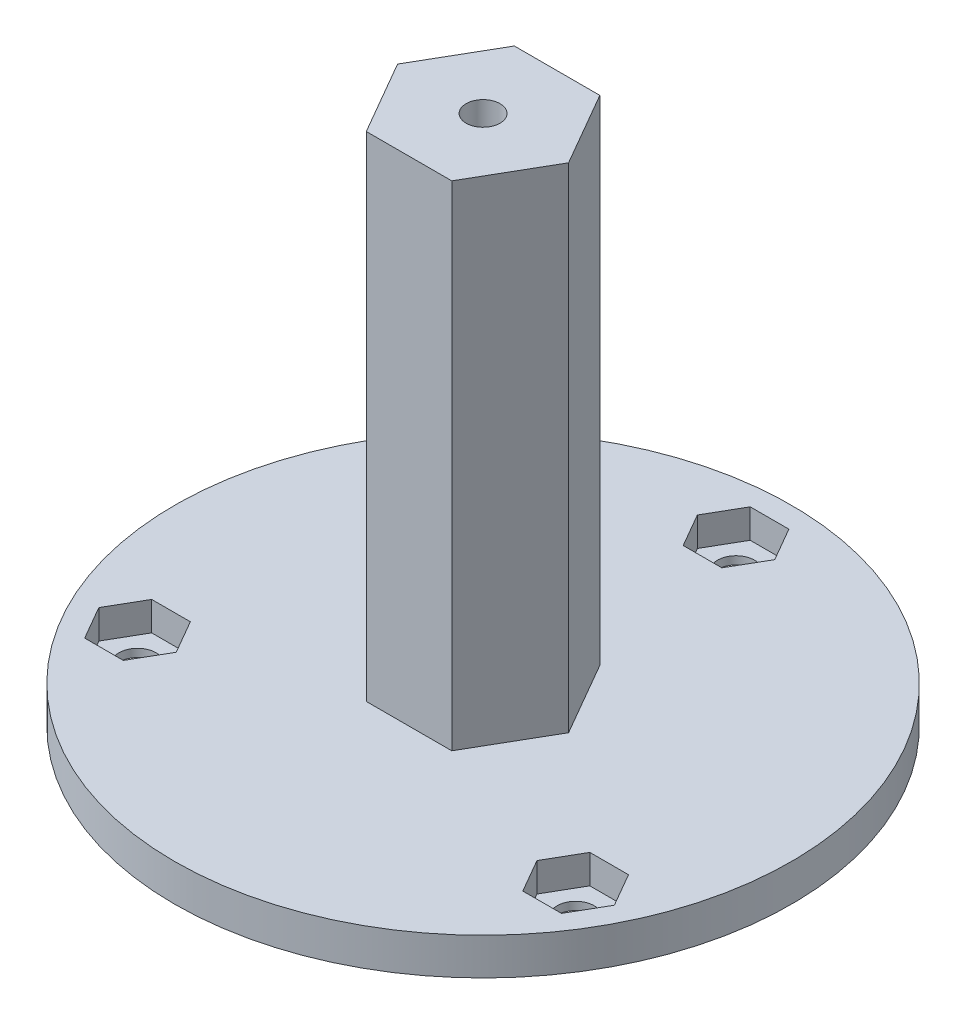
ISO-10303-21;
HEADER;
FILE_DESCRIPTION(('STEP AP214'),'2;1');
FILE_NAME('part.step','',(''),(''),'','','');
FILE_SCHEMA(('AUTOMOTIVE_DESIGN { 1 0 10303 214 1 1 1 1 }'));
ENDSEC;
DATA;
#1=APPLICATION_CONTEXT('core data for automotive mechanical design processes');
#2=APPLICATION_PROTOCOL_DEFINITION('international standard','automotive_design',2000,#1);
#3=PRODUCT_CONTEXT('',#1,'mechanical');
#4=PRODUCT('Part','Part','',(#3));
#5=PRODUCT_RELATED_PRODUCT_CATEGORY('part','',(#4));
#6=PRODUCT_DEFINITION_FORMATION('','',#4);
#7=PRODUCT_DEFINITION_CONTEXT('part definition',#1,'design');
#8=PRODUCT_DEFINITION('design','',#6,#7);
#9=PRODUCT_DEFINITION_SHAPE('','',#8);
#10=(LENGTH_UNIT() NAMED_UNIT(*) SI_UNIT(.MILLI.,.METRE.));
#11=(NAMED_UNIT(*) PLANE_ANGLE_UNIT() SI_UNIT($,.RADIAN.));
#12=(NAMED_UNIT(*) SI_UNIT($,.STERADIAN.) SOLID_ANGLE_UNIT());
#13=UNCERTAINTY_MEASURE_WITH_UNIT(LENGTH_MEASURE(1.E-05),#10,'distance_accuracy_value','');
#14=(GEOMETRIC_REPRESENTATION_CONTEXT(3) GLOBAL_UNCERTAINTY_ASSIGNED_CONTEXT((#13)) GLOBAL_UNIT_ASSIGNED_CONTEXT((#10,
#11,#12)) REPRESENTATION_CONTEXT('',''));
#15=CARTESIAN_POINT('',(0.,0.,0.));
#16=DIRECTION('',(0.,0.,1.));
#17=DIRECTION('',(1.,0.,0.));
#18=AXIS2_PLACEMENT_3D('',#15,#16,#17);
#19=CARTESIAN_POINT('',(0.,3.,-20.5));
#20=DIRECTION('',(0.,-1.,0.));
#21=DIRECTION('',(0.,0.,-1.));
#22=AXIS2_PLACEMENT_3D('',#19,#20,#21);
#23=CYLINDRICAL_SURFACE('',#22,1.5);
#24=CARTESIAN_POINT('',(0.,0.,-20.5));
#25=DIRECTION('',(0.,1.,0.));
#26=DIRECTION('',(0.,0.,1.));
#27=AXIS2_PLACEMENT_3D('',#24,#25,#26);
#28=CIRCLE('',#27,1.5);
#29=CARTESIAN_POINT('',(0.,0.,-19.));
#30=VERTEX_POINT('',#29);
#31=EDGE_CURVE('E406',#30,#30,#28,.T.);
#32=ORIENTED_EDGE('',*,*,#31,.F.);
#33=EDGE_LOOP('',(#32));
#34=FACE_BOUND('',#33,.T.);
#35=CARTESIAN_POINT('',(0.,0.65,-20.5));
#36=DIRECTION('',(0.,1.,0.));
#37=DIRECTION('',(0.,0.,1.));
#38=AXIS2_PLACEMENT_3D('',#35,#36,#37);
#39=CIRCLE('',#38,1.5);
#40=CARTESIAN_POINT('',(0.,0.65,-19.));
#41=VERTEX_POINT('',#40);
#42=EDGE_CURVE('E43',#41,#41,#39,.T.);
#43=ORIENTED_EDGE('',*,*,#42,.T.);
#44=EDGE_LOOP('',(#43));
#45=FACE_BOUND('',#44,.T.);
#46=ADVANCED_FACE('F39',(#34,#45),#23,.F.);
#47=CARTESIAN_POINT('',(17.753520777581,3.,10.25));
#48=DIRECTION('',(0.,-1.,0.));
#49=DIRECTION('',(0.,0.,-1.));
#50=AXIS2_PLACEMENT_3D('',#47,#48,#49);
#51=CYLINDRICAL_SURFACE('',#50,1.5);
#52=CARTESIAN_POINT('',(17.753520777581,0.,10.25));
#53=DIRECTION('',(0.,1.,0.));
#54=DIRECTION('',(0.,0.,1.));
#55=AXIS2_PLACEMENT_3D('',#52,#53,#54);
#56=CIRCLE('',#55,1.5);
#57=CARTESIAN_POINT('',(17.753520777581,0.,11.75));
#58=VERTEX_POINT('',#57);
#59=EDGE_CURVE('E403',#58,#58,#56,.T.);
#60=ORIENTED_EDGE('',*,*,#59,.F.);
#61=EDGE_LOOP('',(#60));
#62=FACE_BOUND('',#61,.T.);
#63=CARTESIAN_POINT('',(17.753520777581,0.65,10.25));
#64=DIRECTION('',(0.,1.,0.));
#65=DIRECTION('',(0.,0.,1.));
#66=AXIS2_PLACEMENT_3D('',#63,#64,#65);
#67=CIRCLE('',#66,1.5);
#68=CARTESIAN_POINT('',(17.753520777581,0.65,11.75));
#69=VERTEX_POINT('',#68);
#70=EDGE_CURVE('E412',#69,#69,#67,.T.);
#71=ORIENTED_EDGE('',*,*,#70,.T.);
#72=EDGE_LOOP('',(#71));
#73=FACE_BOUND('',#72,.T.);
#74=ADVANCED_FACE('F500',(#62,#73),#51,.F.);
#75=CARTESIAN_POINT('',(-17.753520777581,3.,10.25));
#76=DIRECTION('',(0.,-1.,0.));
#77=DIRECTION('',(0.,0.,-1.));
#78=AXIS2_PLACEMENT_3D('',#75,#76,#77);
#79=CYLINDRICAL_SURFACE('',#78,1.5);
#80=CARTESIAN_POINT('',(-17.753520777581,0.,10.25));
#81=DIRECTION('',(0.,1.,0.));
#82=DIRECTION('',(0.,0.,1.));
#83=AXIS2_PLACEMENT_3D('',#80,#81,#82);
#84=CIRCLE('',#83,1.5);
#85=CARTESIAN_POINT('',(-17.753520777581,0.,11.75));
#86=VERTEX_POINT('',#85);
#87=EDGE_CURVE('E400',#86,#86,#84,.T.);
#88=ORIENTED_EDGE('',*,*,#87,.F.);
#89=EDGE_LOOP('',(#88));
#90=FACE_BOUND('',#89,.T.);
#91=CARTESIAN_POINT('',(-17.753520777581,0.65,10.25));
#92=DIRECTION('',(0.,1.,0.));
#93=DIRECTION('',(0.,0.,1.));
#94=AXIS2_PLACEMENT_3D('',#91,#92,#93);
#95=CIRCLE('',#94,1.5);
#96=CARTESIAN_POINT('',(-17.753520777581,0.65,11.75));
#97=VERTEX_POINT('',#96);
#98=EDGE_CURVE('E250',#97,#97,#95,.T.);
#99=ORIENTED_EDGE('',*,*,#98,.T.);
#100=EDGE_LOOP('',(#99));
#101=FACE_BOUND('',#100,.T.);
#102=ADVANCED_FACE('F451',(#90,#101),#79,.F.);
#103=CARTESIAN_POINT('',(0.,3.,0.));
#104=DIRECTION('',(0.,1.,0.));
#105=DIRECTION('',(0.,0.,1.));
#106=AXIS2_PLACEMENT_3D('',#103,#104,#105);
#107=PLANE('',#106);
#108=DIRECTION('',(1.,0.,0.));
#109=VECTOR('',#108,1.);
#110=CARTESIAN_POINT('',(16.1860147967303,3.,12.9650000000011));
#111=LINE('',#110,#109);
#112=CARTESIAN_POINT('',(16.1860147967303,3.,12.9650000000011));
#113=VERTEX_POINT('',#112);
#114=CARTESIAN_POINT('',(19.3210267584299,3.,12.9650000000013));
#115=VERTEX_POINT('',#114);
#116=EDGE_CURVE('E56',#113,#115,#111,.T.);
#117=ORIENTED_EDGE('',*,*,#116,.F.);
#118=DIRECTION('',(0.499999999999942,0.,0.866025403784472));
#119=VECTOR('',#118,1.);
#120=CARTESIAN_POINT('',(14.6185088158806,3.,10.250000000001));
#121=LINE('',#120,#119);
#122=CARTESIAN_POINT('',(14.6185088158806,3.,10.250000000001));
#123=VERTEX_POINT('',#122);
#124=EDGE_CURVE('E223',#123,#113,#121,.T.);
#125=ORIENTED_EDGE('',*,*,#124,.F.);
#126=DIRECTION('',(-0.500000000000059,0.,0.866025403784405));
#127=VECTOR('',#126,1.);
#128=CARTESIAN_POINT('',(16.1860147967306,3.,7.53500000000109));
#129=LINE('',#128,#127);
#130=CARTESIAN_POINT('',(16.1860147967306,3.,7.53500000000109));
#131=VERTEX_POINT('',#130);
#132=EDGE_CURVE('E226',#131,#123,#129,.T.);
#133=ORIENTED_EDGE('',*,*,#132,.F.);
#134=DIRECTION('',(-1.,0.,0.));
#135=VECTOR('',#134,1.);
#136=CARTESIAN_POINT('',(19.3210267584303,3.,7.53500000000131));
#137=LINE('',#136,#135);
#138=CARTESIAN_POINT('',(19.3210267584303,3.,7.53500000000131));
#139=VERTEX_POINT('',#138);
#140=EDGE_CURVE('E243',#139,#131,#137,.T.);
#141=ORIENTED_EDGE('',*,*,#140,.F.);
#142=DIRECTION('',(-0.49999999999994,0.,-0.866025403784473));
#143=VECTOR('',#142,1.);
#144=CARTESIAN_POINT('',(20.88853273928,3.,10.2500000000014));
#145=LINE('',#144,#143);
#146=CARTESIAN_POINT('',(20.88853273928,3.,10.2500000000014));
#147=VERTEX_POINT('',#146);
#148=EDGE_CURVE('E240',#147,#139,#145,.T.);
#149=ORIENTED_EDGE('',*,*,#148,.F.);
#150=DIRECTION('',(0.500000000000058,0.,-0.866025403784405));
#151=VECTOR('',#150,1.);
#152=CARTESIAN_POINT('',(19.3210267584299,3.,12.9650000000013));
#153=LINE('',#152,#151);
#154=EDGE_CURVE('E237',#115,#147,#153,.T.);
#155=ORIENTED_EDGE('',*,*,#154,.F.);
#156=EDGE_LOOP('',(#117,#125,#133,#141,#149,#155));
#157=FACE_BOUND('',#156,.T.);
#158=DIRECTION('',(-0.5,0.,-0.866025403784439));
#159=VECTOR('',#158,1.);
#160=CARTESIAN_POINT('',(3.13501196169967,3.,-20.5));
#161=LINE('',#160,#159);
#162=CARTESIAN_POINT('',(3.13501196169967,3.,-20.5));
#163=VERTEX_POINT('',#162);
#164=CARTESIAN_POINT('',(1.56750598084984,3.,-23.215));
#165=VERTEX_POINT('',#164);
#166=EDGE_CURVE('E64',#163,#165,#161,.T.);
#167=ORIENTED_EDGE('',*,*,#166,.F.);
#168=DIRECTION('',(0.5,0.,-0.866025403784439));
#169=VECTOR('',#168,1.);
#170=CARTESIAN_POINT('',(1.56750598084983,3.,-17.785));
#171=LINE('',#170,#169);
#172=CARTESIAN_POINT('',(1.56750598084983,3.,-17.785));
#173=VERTEX_POINT('',#172);
#174=EDGE_CURVE('E262',#173,#163,#171,.T.);
#175=ORIENTED_EDGE('',*,*,#174,.F.);
#176=DIRECTION('',(1.,0.,0.));
#177=VECTOR('',#176,1.);
#178=CARTESIAN_POINT('',(-1.56750598084983,3.,-17.785));
#179=LINE('',#178,#177);
#180=CARTESIAN_POINT('',(-1.56750598084983,3.,-17.785));
#181=VERTEX_POINT('',#180);
#182=EDGE_CURVE('E289',#181,#173,#179,.T.);
#183=ORIENTED_EDGE('',*,*,#182,.F.);
#184=DIRECTION('',(0.5,0.,0.866025403784439));
#185=VECTOR('',#184,1.);
#186=CARTESIAN_POINT('',(-3.13501196169967,3.,-20.5));
#187=LINE('',#186,#185);
#188=CARTESIAN_POINT('',(-3.13501196169967,3.,-20.5));
#189=VERTEX_POINT('',#188);
#190=EDGE_CURVE('E286',#189,#181,#187,.T.);
#191=ORIENTED_EDGE('',*,*,#190,.F.);
#192=DIRECTION('',(-0.500000000000001,0.,0.866025403784438));
#193=VECTOR('',#192,1.);
#194=CARTESIAN_POINT('',(-1.56750598084984,3.,-23.215));
#195=LINE('',#194,#193);
#196=CARTESIAN_POINT('',(-1.56750598084984,3.,-23.215));
#197=VERTEX_POINT('',#196);
#198=EDGE_CURVE('E283',#197,#189,#195,.T.);
#199=ORIENTED_EDGE('',*,*,#198,.F.);
#200=DIRECTION('',(-1.,0.,0.));
#201=VECTOR('',#200,1.);
#202=CARTESIAN_POINT('',(1.56750598084984,3.,-23.215));
#203=LINE('',#202,#201);
#204=EDGE_CURVE('E279',#165,#197,#203,.T.);
#205=ORIENTED_EDGE('',*,*,#204,.F.);
#206=EDGE_LOOP('',(#167,#175,#183,#191,#199,#205));
#207=FACE_BOUND('',#206,.T.);
#208=DIRECTION('',(-0.500000000000116,0.,0.866025403784372));
#209=VECTOR('',#208,1.);
#210=CARTESIAN_POINT('',(-19.3210267584319,3.,7.53499999999739));
#211=LINE('',#210,#209);
#212=CARTESIAN_POINT('',(-19.3210267584319,3.,7.53499999999739));
#213=VERTEX_POINT('',#212);
#214=CARTESIAN_POINT('',(-20.888532739282,3.,10.2499999999972));
#215=VERTEX_POINT('',#214);
#216=EDGE_CURVE('E324',#213,#215,#211,.T.);
#217=ORIENTED_EDGE('',*,*,#216,.F.);
#218=DIRECTION('',(-1.,0.,-1.36121322758505E-13));
#219=VECTOR('',#218,1.);
#220=CARTESIAN_POINT('',(-16.1860147967322,3.,7.53499999999781));
#221=LINE('',#220,#219);
#222=CARTESIAN_POINT('',(-16.1860147967322,3.,7.53499999999781));
#223=VERTEX_POINT('',#222);
#224=EDGE_CURVE('E308',#223,#213,#221,.T.);
#225=ORIENTED_EDGE('',*,*,#224,.F.);
#226=DIRECTION('',(-0.499999999999883,0.,-0.866025403784506));
#227=VECTOR('',#226,1.);
#228=CARTESIAN_POINT('',(-14.6185088158827,3.,10.249999999998));
#229=LINE('',#228,#227);
#230=CARTESIAN_POINT('',(-14.6185088158827,3.,10.249999999998));
#231=VERTEX_POINT('',#230);
#232=EDGE_CURVE('E335',#231,#223,#229,.T.);
#233=ORIENTED_EDGE('',*,*,#232,.F.);
#234=DIRECTION('',(0.500000000000119,0.,-0.86602540378437));
#235=VECTOR('',#234,1.);
#236=CARTESIAN_POINT('',(-16.1860147967329,3.,12.9649999999978));
#237=LINE('',#236,#235);
#238=CARTESIAN_POINT('',(-16.1860147967329,3.,12.9649999999978));
#239=VERTEX_POINT('',#238);
#240=EDGE_CURVE('E332',#239,#231,#237,.T.);
#241=ORIENTED_EDGE('',*,*,#240,.F.);
#242=DIRECTION('',(1.,0.,1.37228000179307E-13));
#243=VECTOR('',#242,1.);
#244=CARTESIAN_POINT('',(-19.3210267584326,3.,12.9649999999974));
#245=LINE('',#244,#243);
#246=CARTESIAN_POINT('',(-19.3210267584326,3.,12.9649999999974));
#247=VERTEX_POINT('',#246);
#248=EDGE_CURVE('E329',#247,#239,#245,.T.);
#249=ORIENTED_EDGE('',*,*,#248,.F.);
#250=DIRECTION('',(0.499999999999885,0.,0.866025403784505));
#251=VECTOR('',#250,1.);
#252=CARTESIAN_POINT('',(-20.888532739282,3.,10.2499999999972));
#253=LINE('',#252,#251);
#254=EDGE_CURVE('E326',#215,#247,#253,.T.);
#255=ORIENTED_EDGE('',*,*,#254,.F.);
#256=EDGE_LOOP('',(#217,#225,#233,#241,#249,#255));
#257=FACE_BOUND('',#256,.T.);
#258=CARTESIAN_POINT('',(0.,3.,0.));
#259=DIRECTION('',(0.,1.,0.));
#260=DIRECTION('',(0.,0.,1.));
#261=AXIS2_PLACEMENT_3D('',#258,#259,#260);
#262=CIRCLE('',#261,25.);
#263=CARTESIAN_POINT('',(0.,3.,25.));
#264=VERTEX_POINT('',#263);
#265=EDGE_CURVE('E11',#264,#264,#262,.T.);
#266=ORIENTED_EDGE('',*,*,#265,.T.);
#267=EDGE_LOOP('',(#266));
#268=FACE_BOUND('',#267,.T.);
#269=DIRECTION('',(0.5,0.,0.866025403784439));
#270=VECTOR('',#269,1.);
#271=CARTESIAN_POINT('',(-6.92820323027551,3.,0.));
#272=LINE('',#271,#270);
#273=CARTESIAN_POINT('',(-6.92820323027551,3.,0.));
#274=VERTEX_POINT('',#273);
#275=CARTESIAN_POINT('',(-3.46410161513775,3.,6.));
#276=VERTEX_POINT('',#275);
#277=EDGE_CURVE('E375',#274,#276,#272,.T.);
#278=ORIENTED_EDGE('',*,*,#277,.F.);
#279=DIRECTION('',(-0.5,0.,0.866025403784438));
#280=VECTOR('',#279,1.);
#281=CARTESIAN_POINT('',(-3.46410161513775,3.,-6.));
#282=LINE('',#281,#280);
#283=CARTESIAN_POINT('',(-3.46410161513775,3.,-6.));
#284=VERTEX_POINT('',#283);
#285=EDGE_CURVE('E354',#284,#274,#282,.T.);
#286=ORIENTED_EDGE('',*,*,#285,.F.);
#287=DIRECTION('',(-1.,0.,0.));
#288=VECTOR('',#287,1.);
#289=CARTESIAN_POINT('',(3.46410161513775,3.,-6.));
#290=LINE('',#289,#288);
#291=CARTESIAN_POINT('',(3.46410161513775,3.,-6.));
#292=VERTEX_POINT('',#291);
#293=EDGE_CURVE('E362',#292,#284,#290,.T.);
#294=ORIENTED_EDGE('',*,*,#293,.F.);
#295=DIRECTION('',(-0.5,0.,-0.866025403784439));
#296=VECTOR('',#295,1.);
#297=CARTESIAN_POINT('',(6.92820323027551,3.,0.));
#298=LINE('',#297,#296);
#299=CARTESIAN_POINT('',(6.92820323027551,3.,0.));
#300=VERTEX_POINT('',#299);
#301=EDGE_CURVE('E381',#300,#292,#298,.T.);
#302=ORIENTED_EDGE('',*,*,#301,.F.);
#303=DIRECTION('',(0.5,0.,-0.866025403784439));
#304=VECTOR('',#303,1.);
#305=CARTESIAN_POINT('',(3.46410161513775,3.,6.));
#306=LINE('',#305,#304);
#307=CARTESIAN_POINT('',(3.46410161513775,3.,6.));
#308=VERTEX_POINT('',#307);
#309=EDGE_CURVE('E379',#308,#300,#306,.T.);
#310=ORIENTED_EDGE('',*,*,#309,.F.);
#311=DIRECTION('',(1.,0.,0.));
#312=VECTOR('',#311,1.);
#313=CARTESIAN_POINT('',(-3.46410161513775,3.,6.));
#314=LINE('',#313,#312);
#315=EDGE_CURVE('E377',#276,#308,#314,.T.);
#316=ORIENTED_EDGE('',*,*,#315,.F.);
#317=EDGE_LOOP('',(#278,#286,#294,#302,#310,#316));
#318=FACE_BOUND('',#317,.T.);
#319=ADVANCED_FACE('F447',(#157,#207,#257,#268,#318),#107,.T.);
#320=CARTESIAN_POINT('',(0.,0.,0.));
#321=DIRECTION('',(0.,1.,0.));
#322=DIRECTION('',(0.,0.,1.));
#323=AXIS2_PLACEMENT_3D('',#320,#321,#322);
#324=PLANE('',#323);
#325=CARTESIAN_POINT('',(0.,0.,0.));
#326=DIRECTION('',(0.,1.,0.));
#327=DIRECTION('',(0.,0.,1.));
#328=AXIS2_PLACEMENT_3D('',#325,#326,#327);
#329=CIRCLE('',#328,25.);
#330=CARTESIAN_POINT('',(0.,0.,25.));
#331=VERTEX_POINT('',#330);
#332=EDGE_CURVE('E48',#331,#331,#329,.T.);
#333=ORIENTED_EDGE('',*,*,#332,.F.);
#334=EDGE_LOOP('',(#333));
#335=FACE_BOUND('',#334,.T.);
#336=ORIENTED_EDGE('',*,*,#31,.T.);
#337=EDGE_LOOP('',(#336));
#338=FACE_BOUND('',#337,.T.);
#339=ORIENTED_EDGE('',*,*,#59,.T.);
#340=EDGE_LOOP('',(#339));
#341=FACE_BOUND('',#340,.T.);
#342=ORIENTED_EDGE('',*,*,#87,.T.);
#343=EDGE_LOOP('',(#342));
#344=FACE_BOUND('',#343,.T.);
#345=ADVANCED_FACE('F450',(#335,#338,#341,#344),#324,.F.);
#346=CARTESIAN_POINT('',(0.,3.,0.));
#347=DIRECTION('',(0.,-1.,0.));
#348=DIRECTION('',(0.,0.,-1.));
#349=AXIS2_PLACEMENT_3D('',#346,#347,#348);
#350=CYLINDRICAL_SURFACE('',#349,25.);
#351=ORIENTED_EDGE('',*,*,#265,.F.);
#352=EDGE_LOOP('',(#351));
#353=FACE_BOUND('',#352,.T.);
#354=ORIENTED_EDGE('',*,*,#332,.T.);
#355=EDGE_LOOP('',(#354));
#356=FACE_BOUND('',#355,.T.);
#357=ADVANCED_FACE('F41',(#353,#356),#350,.T.);
#358=CARTESIAN_POINT('',(-3.46410161513775,43.,-6.));
#359=DIRECTION('',(0.866025403784438,0.,0.5));
#360=DIRECTION('',(0.5,0.,-0.866025403784439));
#361=AXIS2_PLACEMENT_3D('',#358,#359,#360);
#362=PLANE('',#361);
#363=ORIENTED_EDGE('',*,*,#285,.T.);
#364=DIRECTION('',(0.,-1.,0.));
#365=VECTOR('',#364,1.);
#366=CARTESIAN_POINT('',(-6.92820323027551,43.,0.));
#367=LINE('',#366,#365);
#368=CARTESIAN_POINT('',(-6.92820323027551,43.,0.));
#369=VERTEX_POINT('',#368);
#370=EDGE_CURVE('E398',#369,#274,#367,.T.);
#371=ORIENTED_EDGE('',*,*,#370,.F.);
#372=DIRECTION('',(-0.5,0.,0.866025403784438));
#373=VECTOR('',#372,1.);
#374=CARTESIAN_POINT('',(-3.46410161513775,43.,-6.));
#375=LINE('',#374,#373);
#376=CARTESIAN_POINT('',(-3.46410161513775,43.,-6.));
#377=VERTEX_POINT('',#376);
#378=EDGE_CURVE('E358',#377,#369,#375,.T.);
#379=ORIENTED_EDGE('',*,*,#378,.F.);
#380=DIRECTION('',(0.,-1.,0.));
#381=VECTOR('',#380,1.);
#382=CARTESIAN_POINT('',(-3.46410161513775,43.,-6.));
#383=LINE('',#382,#381);
#384=EDGE_CURVE('E372',#377,#284,#383,.T.);
#385=ORIENTED_EDGE('',*,*,#384,.T.);
#386=EDGE_LOOP('',(#363,#371,#379,#385));
#387=FACE_BOUND('',#386,.T.);
#388=ADVANCED_FACE('F481',(#387),#362,.F.);
#389=CARTESIAN_POINT('',(-6.92820323027551,43.,0.));
#390=DIRECTION('',(0.866025403784439,0.,-0.5));
#391=DIRECTION('',(-0.5,0.,-0.866025403784439));
#392=AXIS2_PLACEMENT_3D('',#389,#390,#391);
#393=PLANE('',#392);
#394=ORIENTED_EDGE('',*,*,#277,.T.);
#395=DIRECTION('',(0.,-1.,0.));
#396=VECTOR('',#395,1.);
#397=CARTESIAN_POINT('',(-3.46410161513775,43.,6.));
#398=LINE('',#397,#396);
#399=CARTESIAN_POINT('',(-3.46410161513775,43.,6.));
#400=VERTEX_POINT('',#399);
#401=EDGE_CURVE('E395',#400,#276,#398,.T.);
#402=ORIENTED_EDGE('',*,*,#401,.F.);
#403=DIRECTION('',(0.5,0.,0.866025403784439));
#404=VECTOR('',#403,1.);
#405=CARTESIAN_POINT('',(-6.92820323027551,43.,0.));
#406=LINE('',#405,#404);
#407=EDGE_CURVE('E361',#369,#400,#406,.T.);
#408=ORIENTED_EDGE('',*,*,#407,.F.);
#409=ORIENTED_EDGE('',*,*,#370,.T.);
#410=EDGE_LOOP('',(#394,#402,#408,#409));
#411=FACE_BOUND('',#410,.T.);
#412=ADVANCED_FACE('F467',(#411),#393,.F.);
#413=CARTESIAN_POINT('',(-3.46410161513775,43.,6.));
#414=DIRECTION('',(0.,0.,-1.));
#415=DIRECTION('',(-1.,0.,0.));
#416=AXIS2_PLACEMENT_3D('',#413,#414,#415);
#417=PLANE('',#416);
#418=ORIENTED_EDGE('',*,*,#315,.T.);
#419=DIRECTION('',(0.,-1.,0.));
#420=VECTOR('',#419,1.);
#421=CARTESIAN_POINT('',(3.46410161513775,43.,6.));
#422=LINE('',#421,#420);
#423=CARTESIAN_POINT('',(3.46410161513775,43.,6.));
#424=VERTEX_POINT('',#423);
#425=EDGE_CURVE('E392',#424,#308,#422,.T.);
#426=ORIENTED_EDGE('',*,*,#425,.F.);
#427=DIRECTION('',(1.,0.,0.));
#428=VECTOR('',#427,1.);
#429=CARTESIAN_POINT('',(-3.46410161513775,43.,6.));
#430=LINE('',#429,#428);
#431=EDGE_CURVE('E364',#400,#424,#430,.T.);
#432=ORIENTED_EDGE('',*,*,#431,.F.);
#433=ORIENTED_EDGE('',*,*,#401,.T.);
#434=EDGE_LOOP('',(#418,#426,#432,#433));
#435=FACE_BOUND('',#434,.T.);
#436=ADVANCED_FACE('F471',(#435),#417,.F.);
#437=CARTESIAN_POINT('',(3.46410161513775,43.,6.));
#438=DIRECTION('',(-0.866025403784439,0.,-0.5));
#439=DIRECTION('',(-0.5,0.,0.866025403784439));
#440=AXIS2_PLACEMENT_3D('',#437,#438,#439);
#441=PLANE('',#440);
#442=ORIENTED_EDGE('',*,*,#309,.T.);
#443=DIRECTION('',(0.,-1.,0.));
#444=VECTOR('',#443,1.);
#445=CARTESIAN_POINT('',(6.92820323027551,43.,0.));
#446=LINE('',#445,#444);
#447=CARTESIAN_POINT('',(6.92820323027551,43.,0.));
#448=VERTEX_POINT('',#447);
#449=EDGE_CURVE('E389',#448,#300,#446,.T.);
#450=ORIENTED_EDGE('',*,*,#449,.F.);
#451=DIRECTION('',(0.5,0.,-0.866025403784439));
#452=VECTOR('',#451,1.);
#453=CARTESIAN_POINT('',(3.46410161513775,43.,6.));
#454=LINE('',#453,#452);
#455=EDGE_CURVE('E366',#424,#448,#454,.T.);
#456=ORIENTED_EDGE('',*,*,#455,.F.);
#457=ORIENTED_EDGE('',*,*,#425,.T.);
#458=EDGE_LOOP('',(#442,#450,#456,#457));
#459=FACE_BOUND('',#458,.T.);
#460=ADVANCED_FACE('F490',(#459),#441,.F.);
#461=CARTESIAN_POINT('',(6.92820323027551,43.,0.));
#462=DIRECTION('',(-0.866025403784439,0.,0.5));
#463=DIRECTION('',(0.5,0.,0.866025403784439));
#464=AXIS2_PLACEMENT_3D('',#461,#462,#463);
#465=PLANE('',#464);
#466=ORIENTED_EDGE('',*,*,#301,.T.);
#467=DIRECTION('',(0.,-1.,0.));
#468=VECTOR('',#467,1.);
#469=CARTESIAN_POINT('',(3.46410161513775,43.,-6.));
#470=LINE('',#469,#468);
#471=CARTESIAN_POINT('',(3.46410161513775,43.,-6.));
#472=VERTEX_POINT('',#471);
#473=EDGE_CURVE('E387',#472,#292,#470,.T.);
#474=ORIENTED_EDGE('',*,*,#473,.F.);
#475=DIRECTION('',(-0.5,0.,-0.866025403784439));
#476=VECTOR('',#475,1.);
#477=CARTESIAN_POINT('',(6.92820323027551,43.,0.));
#478=LINE('',#477,#476);
#479=EDGE_CURVE('E368',#448,#472,#478,.T.);
#480=ORIENTED_EDGE('',*,*,#479,.F.);
#481=ORIENTED_EDGE('',*,*,#449,.T.);
#482=EDGE_LOOP('',(#466,#474,#480,#481));
#483=FACE_BOUND('',#482,.T.);
#484=ADVANCED_FACE('F487',(#483),#465,.F.);
#485=CARTESIAN_POINT('',(3.46410161513775,43.,-6.));
#486=DIRECTION('',(0.,0.,1.));
#487=DIRECTION('',(1.,0.,0.));
#488=AXIS2_PLACEMENT_3D('',#485,#486,#487);
#489=PLANE('',#488);
#490=ORIENTED_EDGE('',*,*,#293,.T.);
#491=ORIENTED_EDGE('',*,*,#384,.F.);
#492=DIRECTION('',(-1.,0.,0.));
#493=VECTOR('',#492,1.);
#494=CARTESIAN_POINT('',(3.46410161513775,43.,-6.));
#495=LINE('',#494,#493);
#496=EDGE_CURVE('E370',#472,#377,#495,.T.);
#497=ORIENTED_EDGE('',*,*,#496,.F.);
#498=ORIENTED_EDGE('',*,*,#473,.T.);
#499=EDGE_LOOP('',(#490,#491,#497,#498));
#500=FACE_BOUND('',#499,.T.);
#501=ADVANCED_FACE('F483',(#500),#489,.F.);
#502=CARTESIAN_POINT('',(0.,43.,0.));
#503=DIRECTION('',(0.,1.,0.));
#504=DIRECTION('',(0.,0.,1.));
#505=AXIS2_PLACEMENT_3D('',#502,#503,#504);
#506=PLANE('',#505);
#507=CARTESIAN_POINT('',(0.,43.,0.));
#508=DIRECTION('',(0.,1.,0.));
#509=DIRECTION('',(0.,0.,1.));
#510=AXIS2_PLACEMENT_3D('',#507,#508,#509);
#511=CIRCLE('',#510,1.375);
#512=CARTESIAN_POINT('',(0.,43.,1.375));
#513=VERTEX_POINT('',#512);
#514=EDGE_CURVE('E355',#513,#513,#511,.T.);
#515=ORIENTED_EDGE('',*,*,#514,.F.);
#516=EDGE_LOOP('',(#515));
#517=FACE_BOUND('',#516,.T.);
#518=ORIENTED_EDGE('',*,*,#378,.T.);
#519=ORIENTED_EDGE('',*,*,#407,.T.);
#520=ORIENTED_EDGE('',*,*,#431,.T.);
#521=ORIENTED_EDGE('',*,*,#455,.T.);
#522=ORIENTED_EDGE('',*,*,#479,.T.);
#523=ORIENTED_EDGE('',*,*,#496,.T.);
#524=EDGE_LOOP('',(#518,#519,#520,#521,#522,#523));
#525=FACE_BOUND('',#524,.T.);
#526=ADVANCED_FACE('F475',(#517,#525),#506,.T.);
#527=CARTESIAN_POINT('',(0.,35.5,0.));
#528=DIRECTION('',(0.,1.,0.));
#529=DIRECTION('',(0.,0.,1.));
#530=AXIS2_PLACEMENT_3D('',#527,#528,#529);
#531=CYLINDRICAL_SURFACE('',#530,1.375);
#532=CARTESIAN_POINT('',(0.,35.5,0.));
#533=DIRECTION('',(0.,1.,0.));
#534=DIRECTION('',(0.,0.,1.));
#535=AXIS2_PLACEMENT_3D('',#532,#533,#534);
#536=CIRCLE('',#535,1.375);
#537=CARTESIAN_POINT('',(0.,35.5,1.375));
#538=VERTEX_POINT('',#537);
#539=EDGE_CURVE('E351',#538,#538,#536,.T.);
#540=ORIENTED_EDGE('',*,*,#539,.F.);
#541=EDGE_LOOP('',(#540));
#542=FACE_BOUND('',#541,.T.);
#543=ORIENTED_EDGE('',*,*,#514,.T.);
#544=EDGE_LOOP('',(#543));
#545=FACE_BOUND('',#544,.T.);
#546=ADVANCED_FACE('F571',(#542,#545),#531,.F.);
#547=CARTESIAN_POINT('',(0.,35.5,0.));
#548=DIRECTION('',(0.,1.,0.));
#549=DIRECTION('',(0.,0.,1.));
#550=AXIS2_PLACEMENT_3D('',#547,#548,#549);
#551=PLANE('',#550);
#552=ORIENTED_EDGE('',*,*,#539,.T.);
#553=EDGE_LOOP('',(#552));
#554=FACE_BOUND('',#553,.T.);
#555=ADVANCED_FACE('F559',(#554),#551,.T.);
#556=CARTESIAN_POINT('',(-19.3210267584319,0.65,7.53499999999739));
#557=DIRECTION('',(-0.866025403784371,0.,-0.500000000000116));
#558=DIRECTION('',(-0.500000000000116,0.,0.866025403784372));
#559=AXIS2_PLACEMENT_3D('',#556,#557,#558);
#560=PLANE('',#559);
#561=ORIENTED_EDGE('',*,*,#216,.T.);
#562=DIRECTION('',(0.,1.,0.));
#563=VECTOR('',#562,1.);
#564=CARTESIAN_POINT('',(-20.888532739282,0.65,10.2499999999972));
#565=LINE('',#564,#563);
#566=CARTESIAN_POINT('',(-20.888532739282,0.65,10.2499999999972));
#567=VERTEX_POINT('',#566);
#568=EDGE_CURVE('E323',#567,#215,#565,.T.);
#569=ORIENTED_EDGE('',*,*,#568,.F.);
#570=DIRECTION('',(-0.500000000000116,0.,0.866025403784372));
#571=VECTOR('',#570,1.);
#572=CARTESIAN_POINT('',(-19.3210267584319,0.65,7.53499999999739));
#573=LINE('',#572,#571);
#574=CARTESIAN_POINT('',(-19.3210267584319,0.65,7.53499999999739));
#575=VERTEX_POINT('',#574);
#576=EDGE_CURVE('E304',#575,#567,#573,.T.);
#577=ORIENTED_EDGE('',*,*,#576,.F.);
#578=DIRECTION('',(0.,1.,0.));
#579=VECTOR('',#578,1.);
#580=CARTESIAN_POINT('',(-19.3210267584319,0.65,7.53499999999739));
#581=LINE('',#580,#579);
#582=EDGE_CURVE('E280',#575,#213,#581,.T.);
#583=ORIENTED_EDGE('',*,*,#582,.T.);
#584=EDGE_LOOP('',(#561,#569,#577,#583));
#585=FACE_BOUND('',#584,.T.);
#586=ADVANCED_FACE('F536',(#585),#560,.F.);
#587=CARTESIAN_POINT('',(-16.1860147967322,0.65,7.53499999999781));
#588=DIRECTION('',(1.36121322758505E-13,0.,-1.));
#589=DIRECTION('',(-1.,0.,-1.36121322758505E-13));
#590=AXIS2_PLACEMENT_3D('',#587,#588,#589);
#591=PLANE('',#590);
#592=ORIENTED_EDGE('',*,*,#224,.T.);
#593=ORIENTED_EDGE('',*,*,#582,.F.);
#594=DIRECTION('',(-1.,0.,-1.36121322758505E-13));
#595=VECTOR('',#594,1.);
#596=CARTESIAN_POINT('',(-16.1860147967322,0.65,7.53499999999781));
#597=LINE('',#596,#595);
#598=CARTESIAN_POINT('',(-16.1860147967322,0.65,7.53499999999781));
#599=VERTEX_POINT('',#598);
#600=EDGE_CURVE('E320',#599,#575,#597,.T.);
#601=ORIENTED_EDGE('',*,*,#600,.F.);
#602=DIRECTION('',(0.,1.,0.));
#603=VECTOR('',#602,1.);
#604=CARTESIAN_POINT('',(-16.1860147967322,0.65,7.53499999999781));
#605=LINE('',#604,#603);
#606=EDGE_CURVE('E341',#599,#223,#605,.T.);
#607=ORIENTED_EDGE('',*,*,#606,.T.);
#608=EDGE_LOOP('',(#592,#593,#601,#607));
#609=FACE_BOUND('',#608,.T.);
#610=ADVANCED_FACE('F551',(#609),#591,.F.);
#611=CARTESIAN_POINT('',(-14.6185088158827,0.65,10.249999999998));
#612=DIRECTION('',(0.866025403784506,0.,-0.499999999999883));
#613=DIRECTION('',(-0.499999999999883,0.,-0.866025403784506));
#614=AXIS2_PLACEMENT_3D('',#611,#612,#613);
#615=PLANE('',#614);
#616=ORIENTED_EDGE('',*,*,#232,.T.);
#617=ORIENTED_EDGE('',*,*,#606,.F.);
#618=DIRECTION('',(-0.499999999999883,0.,-0.866025403784506));
#619=VECTOR('',#618,1.);
#620=CARTESIAN_POINT('',(-14.6185088158827,0.65,10.249999999998));
#621=LINE('',#620,#619);
#622=CARTESIAN_POINT('',(-14.6185088158827,0.65,10.249999999998));
#623=VERTEX_POINT('',#622);
#624=EDGE_CURVE('E317',#623,#599,#621,.T.);
#625=ORIENTED_EDGE('',*,*,#624,.F.);
#626=DIRECTION('',(0.,1.,0.));
#627=VECTOR('',#626,1.);
#628=CARTESIAN_POINT('',(-14.6185088158827,0.65,10.249999999998));
#629=LINE('',#628,#627);
#630=EDGE_CURVE('E343',#623,#231,#629,.T.);
#631=ORIENTED_EDGE('',*,*,#630,.T.);
#632=EDGE_LOOP('',(#616,#617,#625,#631));
#633=FACE_BOUND('',#632,.T.);
#634=ADVANCED_FACE('F549',(#633),#615,.F.);
#635=CARTESIAN_POINT('',(-16.1860147967329,0.65,12.9649999999978));
#636=DIRECTION('',(0.86602540378437,0.,0.500000000000119));
#637=DIRECTION('',(0.500000000000119,0.,-0.86602540378437));
#638=AXIS2_PLACEMENT_3D('',#635,#636,#637);
#639=PLANE('',#638);
#640=ORIENTED_EDGE('',*,*,#240,.T.);
#641=ORIENTED_EDGE('',*,*,#630,.F.);
#642=DIRECTION('',(0.500000000000119,0.,-0.86602540378437));
#643=VECTOR('',#642,1.);
#644=CARTESIAN_POINT('',(-16.1860147967329,0.65,12.9649999999978));
#645=LINE('',#644,#643);
#646=CARTESIAN_POINT('',(-16.1860147967329,0.65,12.9649999999978));
#647=VERTEX_POINT('',#646);
#648=EDGE_CURVE('E314',#647,#623,#645,.T.);
#649=ORIENTED_EDGE('',*,*,#648,.F.);
#650=DIRECTION('',(0.,1.,0.));
#651=VECTOR('',#650,1.);
#652=CARTESIAN_POINT('',(-16.1860147967329,0.65,12.9649999999978));
#653=LINE('',#652,#651);
#654=EDGE_CURVE('E345',#647,#239,#653,.T.);
#655=ORIENTED_EDGE('',*,*,#654,.T.);
#656=EDGE_LOOP('',(#640,#641,#649,#655));
#657=FACE_BOUND('',#656,.T.);
#658=ADVANCED_FACE('F545',(#657),#639,.F.);
#659=CARTESIAN_POINT('',(-19.3210267584326,0.65,12.9649999999974));
#660=DIRECTION('',(-1.37228000179307E-13,0.,1.));
#661=DIRECTION('',(1.,0.,1.37228000179307E-13));
#662=AXIS2_PLACEMENT_3D('',#659,#660,#661);
#663=PLANE('',#662);
#664=ORIENTED_EDGE('',*,*,#248,.T.);
#665=ORIENTED_EDGE('',*,*,#654,.F.);
#666=DIRECTION('',(1.,0.,1.37228000179307E-13));
#667=VECTOR('',#666,1.);
#668=CARTESIAN_POINT('',(-19.3210267584326,0.65,12.9649999999974));
#669=LINE('',#668,#667);
#670=CARTESIAN_POINT('',(-19.3210267584326,0.65,12.9649999999974));
#671=VERTEX_POINT('',#670);
#672=EDGE_CURVE('E311',#671,#647,#669,.T.);
#673=ORIENTED_EDGE('',*,*,#672,.F.);
#674=DIRECTION('',(0.,1.,0.));
#675=VECTOR('',#674,1.);
#676=CARTESIAN_POINT('',(-19.3210267584326,0.65,12.9649999999974));
#677=LINE('',#676,#675);
#678=EDGE_CURVE('E347',#671,#247,#677,.T.);
#679=ORIENTED_EDGE('',*,*,#678,.T.);
#680=EDGE_LOOP('',(#664,#665,#673,#679));
#681=FACE_BOUND('',#680,.T.);
#682=ADVANCED_FACE('F541',(#681),#663,.F.);
#683=CARTESIAN_POINT('',(-20.888532739282,0.65,10.2499999999972));
#684=DIRECTION('',(-0.866025403784505,0.,0.499999999999885));
#685=DIRECTION('',(0.499999999999885,0.,0.866025403784505));
#686=AXIS2_PLACEMENT_3D('',#683,#684,#685);
#687=PLANE('',#686);
#688=ORIENTED_EDGE('',*,*,#254,.T.);
#689=ORIENTED_EDGE('',*,*,#678,.F.);
#690=DIRECTION('',(0.499999999999885,0.,0.866025403784505));
#691=VECTOR('',#690,1.);
#692=CARTESIAN_POINT('',(-20.888532739282,0.65,10.2499999999972));
#693=LINE('',#692,#691);
#694=EDGE_CURVE('E307',#567,#671,#693,.T.);
#695=ORIENTED_EDGE('',*,*,#694,.F.);
#696=ORIENTED_EDGE('',*,*,#568,.T.);
#697=EDGE_LOOP('',(#688,#689,#695,#696));
#698=FACE_BOUND('',#697,.T.);
#699=ADVANCED_FACE('F530',(#698),#687,.F.);
#700=CARTESIAN_POINT('',(0.,0.65,0.));
#701=DIRECTION('',(0.,1.,0.));
#702=DIRECTION('',(0.,0.,1.));
#703=AXIS2_PLACEMENT_3D('',#700,#701,#702);
#704=PLANE('',#703);
#705=ORIENTED_EDGE('',*,*,#98,.F.);
#706=EDGE_LOOP('',(#705));
#707=FACE_BOUND('',#706,.T.);
#708=ORIENTED_EDGE('',*,*,#576,.T.);
#709=ORIENTED_EDGE('',*,*,#694,.T.);
#710=ORIENTED_EDGE('',*,*,#672,.T.);
#711=ORIENTED_EDGE('',*,*,#648,.T.);
#712=ORIENTED_EDGE('',*,*,#624,.T.);
#713=ORIENTED_EDGE('',*,*,#600,.T.);
#714=EDGE_LOOP('',(#708,#709,#710,#711,#712,#713));
#715=FACE_BOUND('',#714,.T.);
#716=ADVANCED_FACE('F527',(#707,#715),#704,.T.);
#717=CARTESIAN_POINT('',(16.1860147967303,0.65,12.9650000000011));
#718=DIRECTION('',(0.,0.,1.));
#719=DIRECTION('',(1.,0.,0.));
#720=AXIS2_PLACEMENT_3D('',#717,#718,#719);
#721=PLANE('',#720);
#722=ORIENTED_EDGE('',*,*,#116,.T.);
#723=DIRECTION('',(0.,1.,0.));
#724=VECTOR('',#723,1.);
#725=CARTESIAN_POINT('',(19.3210267584299,0.65,12.9650000000013));
#726=LINE('',#725,#724);
#727=CARTESIAN_POINT('',(19.3210267584299,0.65,12.9650000000013));
#728=VERTEX_POINT('',#727);
#729=EDGE_CURVE('E200',#728,#115,#726,.T.);
#730=ORIENTED_EDGE('',*,*,#729,.F.);
#731=DIRECTION('',(1.,0.,0.));
#732=VECTOR('',#731,1.);
#733=CARTESIAN_POINT('',(16.1860147967303,0.65,12.9650000000011));
#734=LINE('',#733,#732);
#735=CARTESIAN_POINT('',(16.1860147967303,0.65,12.9650000000011));
#736=VERTEX_POINT('',#735);
#737=EDGE_CURVE('E204',#736,#728,#734,.T.);
#738=ORIENTED_EDGE('',*,*,#737,.F.);
#739=DIRECTION('',(0.,1.,0.));
#740=VECTOR('',#739,1.);
#741=CARTESIAN_POINT('',(16.1860147967303,0.65,12.9650000000011));
#742=LINE('',#741,#740);
#743=EDGE_CURVE('E248',#736,#113,#742,.T.);
#744=ORIENTED_EDGE('',*,*,#743,.T.);
#745=EDGE_LOOP('',(#722,#730,#738,#744));
#746=FACE_BOUND('',#745,.T.);
#747=ADVANCED_FACE('F202',(#746),#721,.F.);
#748=CARTESIAN_POINT('',(14.6185088158806,0.65,10.250000000001));
#749=DIRECTION('',(-0.866025403784472,0.,0.499999999999942));
#750=DIRECTION('',(0.499999999999943,0.,0.866025403784472));
#751=AXIS2_PLACEMENT_3D('',#748,#749,#750);
#752=PLANE('',#751);
#753=ORIENTED_EDGE('',*,*,#124,.T.);
#754=ORIENTED_EDGE('',*,*,#743,.F.);
#755=DIRECTION('',(0.499999999999942,0.,0.866025403784472));
#756=VECTOR('',#755,1.);
#757=CARTESIAN_POINT('',(14.6185088158806,0.65,10.250000000001));
#758=LINE('',#757,#756);
#759=CARTESIAN_POINT('',(14.6185088158806,0.65,10.250000000001));
#760=VERTEX_POINT('',#759);
#761=EDGE_CURVE('E210',#760,#736,#758,.T.);
#762=ORIENTED_EDGE('',*,*,#761,.F.);
#763=DIRECTION('',(0.,1.,0.));
#764=VECTOR('',#763,1.);
#765=CARTESIAN_POINT('',(14.6185088158806,0.65,10.250000000001));
#766=LINE('',#765,#764);
#767=EDGE_CURVE('E251',#760,#123,#766,.T.);
#768=ORIENTED_EDGE('',*,*,#767,.T.);
#769=EDGE_LOOP('',(#753,#754,#762,#768));
#770=FACE_BOUND('',#769,.T.);
#771=ADVANCED_FACE('F648',(#770),#752,.F.);
#772=CARTESIAN_POINT('',(16.1860147967306,0.65,7.53500000000109));
#773=DIRECTION('',(-0.866025403784404,0.,-0.500000000000059));
#774=DIRECTION('',(-0.500000000000059,0.,0.866025403784404));
#775=AXIS2_PLACEMENT_3D('',#772,#773,#774);
#776=PLANE('',#775);
#777=ORIENTED_EDGE('',*,*,#132,.T.);
#778=ORIENTED_EDGE('',*,*,#767,.F.);
#779=DIRECTION('',(-0.500000000000059,0.,0.866025403784405));
#780=VECTOR('',#779,1.);
#781=CARTESIAN_POINT('',(16.1860147967306,0.65,7.53500000000109));
#782=LINE('',#781,#780);
#783=CARTESIAN_POINT('',(16.1860147967306,0.65,7.53500000000109));
#784=VERTEX_POINT('',#783);
#785=EDGE_CURVE('E233',#784,#760,#782,.T.);
#786=ORIENTED_EDGE('',*,*,#785,.F.);
#787=DIRECTION('',(0.,1.,0.));
#788=VECTOR('',#787,1.);
#789=CARTESIAN_POINT('',(16.1860147967306,0.65,7.53500000000109));
#790=LINE('',#789,#788);
#791=EDGE_CURVE('E253',#784,#131,#790,.T.);
#792=ORIENTED_EDGE('',*,*,#791,.T.);
#793=EDGE_LOOP('',(#777,#778,#786,#792));
#794=FACE_BOUND('',#793,.T.);
#795=ADVANCED_FACE('F657',(#794),#776,.F.);
#796=CARTESIAN_POINT('',(19.3210267584303,0.65,7.53500000000131));
#797=DIRECTION('',(0.,0.,-1.));
#798=DIRECTION('',(-1.,0.,0.));
#799=AXIS2_PLACEMENT_3D('',#796,#797,#798);
#800=PLANE('',#799);
#801=ORIENTED_EDGE('',*,*,#140,.T.);
#802=ORIENTED_EDGE('',*,*,#791,.F.);
#803=DIRECTION('',(-1.,0.,0.));
#804=VECTOR('',#803,1.);
#805=CARTESIAN_POINT('',(19.3210267584303,0.65,7.53500000000131));
#806=LINE('',#805,#804);
#807=CARTESIAN_POINT('',(19.3210267584303,0.65,7.53500000000131));
#808=VERTEX_POINT('',#807);
#809=EDGE_CURVE('E230',#808,#784,#806,.T.);
#810=ORIENTED_EDGE('',*,*,#809,.F.);
#811=DIRECTION('',(0.,1.,0.));
#812=VECTOR('',#811,1.);
#813=CARTESIAN_POINT('',(19.3210267584303,0.65,7.53500000000131));
#814=LINE('',#813,#812);
#815=EDGE_CURVE('E255',#808,#139,#814,.T.);
#816=ORIENTED_EDGE('',*,*,#815,.T.);
#817=EDGE_LOOP('',(#801,#802,#810,#816));
#818=FACE_BOUND('',#817,.T.);
#819=ADVANCED_FACE('F667',(#818),#800,.F.);
#820=CARTESIAN_POINT('',(20.88853273928,0.65,10.2500000000014));
#821=DIRECTION('',(0.866025403784473,0.,-0.49999999999994));
#822=DIRECTION('',(-0.49999999999994,0.,-0.866025403784473));
#823=AXIS2_PLACEMENT_3D('',#820,#821,#822);
#824=PLANE('',#823);
#825=ORIENTED_EDGE('',*,*,#148,.T.);
#826=ORIENTED_EDGE('',*,*,#815,.F.);
#827=DIRECTION('',(-0.49999999999994,0.,-0.866025403784473));
#828=VECTOR('',#827,1.);
#829=CARTESIAN_POINT('',(20.88853273928,0.65,10.2500000000014));
#830=LINE('',#829,#828);
#831=CARTESIAN_POINT('',(20.88853273928,0.65,10.2500000000014));
#832=VERTEX_POINT('',#831);
#833=EDGE_CURVE('E218',#832,#808,#830,.T.);
#834=ORIENTED_EDGE('',*,*,#833,.F.);
#835=DIRECTION('',(0.,1.,0.));
#836=VECTOR('',#835,1.);
#837=CARTESIAN_POINT('',(20.88853273928,0.65,10.2500000000014));
#838=LINE('',#837,#836);
#839=EDGE_CURVE('E209',#832,#147,#838,.T.);
#840=ORIENTED_EDGE('',*,*,#839,.T.);
#841=EDGE_LOOP('',(#825,#826,#834,#840));
#842=FACE_BOUND('',#841,.T.);
#843=ADVANCED_FACE('F677',(#842),#824,.F.);
#844=CARTESIAN_POINT('',(19.3210267584299,0.65,12.9650000000013));
#845=DIRECTION('',(0.866025403784405,0.,0.500000000000058));
#846=DIRECTION('',(0.500000000000058,0.,-0.866025403784405));
#847=AXIS2_PLACEMENT_3D('',#844,#845,#846);
#848=PLANE('',#847);
#849=ORIENTED_EDGE('',*,*,#154,.T.);
#850=ORIENTED_EDGE('',*,*,#839,.F.);
#851=DIRECTION('',(0.500000000000058,0.,-0.866025403784405));
#852=VECTOR('',#851,1.);
#853=CARTESIAN_POINT('',(19.3210267584299,0.65,12.9650000000013));
#854=LINE('',#853,#852);
#855=EDGE_CURVE('E213',#728,#832,#854,.T.);
#856=ORIENTED_EDGE('',*,*,#855,.F.);
#857=ORIENTED_EDGE('',*,*,#729,.T.);
#858=EDGE_LOOP('',(#849,#850,#856,#857));
#859=FACE_BOUND('',#858,.T.);
#860=ADVANCED_FACE('F214',(#859),#848,.F.);
#861=CARTESIAN_POINT('',(0.,0.65,0.));
#862=DIRECTION('',(0.,1.,0.));
#863=DIRECTION('',(0.,0.,1.));
#864=AXIS2_PLACEMENT_3D('',#861,#862,#863);
#865=PLANE('',#864);
#866=ORIENTED_EDGE('',*,*,#70,.F.);
#867=EDGE_LOOP('',(#866));
#868=FACE_BOUND('',#867,.T.);
#869=ORIENTED_EDGE('',*,*,#737,.T.);
#870=ORIENTED_EDGE('',*,*,#855,.T.);
#871=ORIENTED_EDGE('',*,*,#833,.T.);
#872=ORIENTED_EDGE('',*,*,#809,.T.);
#873=ORIENTED_EDGE('',*,*,#785,.T.);
#874=ORIENTED_EDGE('',*,*,#761,.T.);
#875=EDGE_LOOP('',(#869,#870,#871,#872,#873,#874));
#876=FACE_BOUND('',#875,.T.);
#877=ADVANCED_FACE('F220',(#868,#876),#865,.T.);
#878=CARTESIAN_POINT('',(3.13501196169967,0.65,-20.5));
#879=DIRECTION('',(0.866025403784439,0.,-0.5));
#880=DIRECTION('',(-0.5,0.,-0.866025403784439));
#881=AXIS2_PLACEMENT_3D('',#878,#879,#880);
#882=PLANE('',#881);
#883=ORIENTED_EDGE('',*,*,#166,.T.);
#884=DIRECTION('',(0.,1.,0.));
#885=VECTOR('',#884,1.);
#886=CARTESIAN_POINT('',(1.56750598084984,0.65,-23.215));
#887=LINE('',#886,#885);
#888=CARTESIAN_POINT('',(1.56750598084984,0.65,-23.215));
#889=VERTEX_POINT('',#888);
#890=EDGE_CURVE('E277',#889,#165,#887,.T.);
#891=ORIENTED_EDGE('',*,*,#890,.F.);
#892=DIRECTION('',(-0.5,0.,-0.866025403784439));
#893=VECTOR('',#892,1.);
#894=CARTESIAN_POINT('',(3.13501196169967,0.65,-20.5));
#895=LINE('',#894,#893);
#896=CARTESIAN_POINT('',(3.13501196169967,0.65,-20.5));
#897=VERTEX_POINT('',#896);
#898=EDGE_CURVE('E258',#897,#889,#895,.T.);
#899=ORIENTED_EDGE('',*,*,#898,.F.);
#900=DIRECTION('',(0.,1.,0.));
#901=VECTOR('',#900,1.);
#902=CARTESIAN_POINT('',(3.13501196169967,0.65,-20.5));
#903=LINE('',#902,#901);
#904=EDGE_CURVE('E238',#897,#163,#903,.T.);
#905=ORIENTED_EDGE('',*,*,#904,.T.);
#906=EDGE_LOOP('',(#883,#891,#899,#905));
#907=FACE_BOUND('',#906,.T.);
#908=ADVANCED_FACE('F428',(#907),#882,.F.);
#909=CARTESIAN_POINT('',(1.56750598084983,0.65,-17.785));
#910=DIRECTION('',(0.866025403784439,0.,0.5));
#911=DIRECTION('',(0.5,0.,-0.866025403784439));
#912=AXIS2_PLACEMENT_3D('',#909,#910,#911);
#913=PLANE('',#912);
#914=ORIENTED_EDGE('',*,*,#174,.T.);
#915=ORIENTED_EDGE('',*,*,#904,.F.);
#916=DIRECTION('',(0.5,0.,-0.866025403784439));
#917=VECTOR('',#916,1.);
#918=CARTESIAN_POINT('',(1.56750598084983,0.65,-17.785));
#919=LINE('',#918,#917);
#920=CARTESIAN_POINT('',(1.56750598084983,0.65,-17.785));
#921=VERTEX_POINT('',#920);
#922=EDGE_CURVE('E274',#921,#897,#919,.T.);
#923=ORIENTED_EDGE('',*,*,#922,.F.);
#924=DIRECTION('',(0.,1.,0.));
#925=VECTOR('',#924,1.);
#926=CARTESIAN_POINT('',(1.56750598084983,0.65,-17.785));
#927=LINE('',#926,#925);
#928=EDGE_CURVE('E295',#921,#173,#927,.T.);
#929=ORIENTED_EDGE('',*,*,#928,.T.);
#930=EDGE_LOOP('',(#914,#915,#923,#929));
#931=FACE_BOUND('',#930,.T.);
#932=ADVANCED_FACE('F445',(#931),#913,.F.);
#933=CARTESIAN_POINT('',(-1.56750598084983,0.65,-17.785));
#934=DIRECTION('',(0.,0.,1.));
#935=DIRECTION('',(1.,0.,0.));
#936=AXIS2_PLACEMENT_3D('',#933,#934,#935);
#937=PLANE('',#936);
#938=ORIENTED_EDGE('',*,*,#182,.T.);
#939=ORIENTED_EDGE('',*,*,#928,.F.);
#940=DIRECTION('',(1.,0.,0.));
#941=VECTOR('',#940,1.);
#942=CARTESIAN_POINT('',(-1.56750598084983,0.65,-17.785));
#943=LINE('',#942,#941);
#944=CARTESIAN_POINT('',(-1.56750598084983,0.65,-17.785));
#945=VERTEX_POINT('',#944);
#946=EDGE_CURVE('E271',#945,#921,#943,.T.);
#947=ORIENTED_EDGE('',*,*,#946,.F.);
#948=DIRECTION('',(0.,1.,0.));
#949=VECTOR('',#948,1.);
#950=CARTESIAN_POINT('',(-1.56750598084983,0.65,-17.785));
#951=LINE('',#950,#949);
#952=EDGE_CURVE('E297',#945,#181,#951,.T.);
#953=ORIENTED_EDGE('',*,*,#952,.T.);
#954=EDGE_LOOP('',(#938,#939,#947,#953));
#955=FACE_BOUND('',#954,.T.);
#956=ADVANCED_FACE('F442',(#955),#937,.F.);
#957=CARTESIAN_POINT('',(-3.13501196169967,0.65,-20.5));
#958=DIRECTION('',(-0.866025403784439,0.,0.5));
#959=DIRECTION('',(0.5,0.,0.866025403784439));
#960=AXIS2_PLACEMENT_3D('',#957,#958,#959);
#961=PLANE('',#960);
#962=ORIENTED_EDGE('',*,*,#190,.T.);
#963=ORIENTED_EDGE('',*,*,#952,.F.);
#964=DIRECTION('',(0.5,0.,0.866025403784439));
#965=VECTOR('',#964,1.);
#966=CARTESIAN_POINT('',(-3.13501196169967,0.65,-20.5));
#967=LINE('',#966,#965);
#968=CARTESIAN_POINT('',(-3.13501196169967,0.65,-20.5));
#969=VERTEX_POINT('',#968);
#970=EDGE_CURVE('E268',#969,#945,#967,.T.);
#971=ORIENTED_EDGE('',*,*,#970,.F.);
#972=DIRECTION('',(0.,1.,0.));
#973=VECTOR('',#972,1.);
#974=CARTESIAN_POINT('',(-3.13501196169967,0.65,-20.5));
#975=LINE('',#974,#973);
#976=EDGE_CURVE('E299',#969,#189,#975,.T.);
#977=ORIENTED_EDGE('',*,*,#976,.T.);
#978=EDGE_LOOP('',(#962,#963,#971,#977));
#979=FACE_BOUND('',#978,.T.);
#980=ADVANCED_FACE('F438',(#979),#961,.F.);
#981=CARTESIAN_POINT('',(-1.56750598084984,0.65,-23.215));
#982=DIRECTION('',(-0.866025403784438,0.,-0.500000000000001));
#983=DIRECTION('',(-0.500000000000001,0.,0.866025403784438));
#984=AXIS2_PLACEMENT_3D('',#981,#982,#983);
#985=PLANE('',#984);
#986=ORIENTED_EDGE('',*,*,#198,.T.);
#987=ORIENTED_EDGE('',*,*,#976,.F.);
#988=DIRECTION('',(-0.500000000000001,0.,0.866025403784438));
#989=VECTOR('',#988,1.);
#990=CARTESIAN_POINT('',(-1.56750598084984,0.65,-23.215));
#991=LINE('',#990,#989);
#992=CARTESIAN_POINT('',(-1.56750598084984,0.65,-23.215));
#993=VERTEX_POINT('',#992);
#994=EDGE_CURVE('E265',#993,#969,#991,.T.);
#995=ORIENTED_EDGE('',*,*,#994,.F.);
#996=DIRECTION('',(0.,1.,0.));
#997=VECTOR('',#996,1.);
#998=CARTESIAN_POINT('',(-1.56750598084984,0.65,-23.215));
#999=LINE('',#998,#997);
#1000=EDGE_CURVE('E301',#993,#197,#999,.T.);
#1001=ORIENTED_EDGE('',*,*,#1000,.T.);
#1002=EDGE_LOOP('',(#986,#987,#995,#1001));
#1003=FACE_BOUND('',#1002,.T.);
#1004=ADVANCED_FACE('F434',(#1003),#985,.F.);
#1005=CARTESIAN_POINT('',(1.56750598084984,0.65,-23.215));
#1006=DIRECTION('',(0.,0.,-1.));
#1007=DIRECTION('',(-1.,0.,0.));
#1008=AXIS2_PLACEMENT_3D('',#1005,#1006,#1007);
#1009=PLANE('',#1008);
#1010=ORIENTED_EDGE('',*,*,#204,.T.);
#1011=ORIENTED_EDGE('',*,*,#1000,.F.);
#1012=DIRECTION('',(-1.,0.,0.));
#1013=VECTOR('',#1012,1.);
#1014=CARTESIAN_POINT('',(1.56750598084984,0.65,-23.215));
#1015=LINE('',#1014,#1013);
#1016=EDGE_CURVE('E261',#889,#993,#1015,.T.);
#1017=ORIENTED_EDGE('',*,*,#1016,.F.);
#1018=ORIENTED_EDGE('',*,*,#890,.T.);
#1019=EDGE_LOOP('',(#1010,#1011,#1017,#1018));
#1020=FACE_BOUND('',#1019,.T.);
#1021=ADVANCED_FACE('F423',(#1020),#1009,.F.);
#1022=CARTESIAN_POINT('',(0.,0.65,0.));
#1023=DIRECTION('',(0.,1.,0.));
#1024=DIRECTION('',(0.,0.,1.));
#1025=AXIS2_PLACEMENT_3D('',#1022,#1023,#1024);
#1026=PLANE('',#1025);
#1027=ORIENTED_EDGE('',*,*,#42,.F.);
#1028=EDGE_LOOP('',(#1027));
#1029=FACE_BOUND('',#1028,.T.);
#1030=ORIENTED_EDGE('',*,*,#898,.T.);
#1031=ORIENTED_EDGE('',*,*,#1016,.T.);
#1032=ORIENTED_EDGE('',*,*,#994,.T.);
#1033=ORIENTED_EDGE('',*,*,#970,.T.);
#1034=ORIENTED_EDGE('',*,*,#946,.T.);
#1035=ORIENTED_EDGE('',*,*,#922,.T.);
#1036=EDGE_LOOP('',(#1030,#1031,#1032,#1033,#1034,#1035));
#1037=FACE_BOUND('',#1036,.T.);
#1038=ADVANCED_FACE('F420',(#1029,#1037),#1026,.T.);
#1039=CLOSED_SHELL('',(#46,#74,#102,#319,#345,#357,#388,#412,#436,#460,#484,#501,#526,#546,#555,
#586,#610,#634,#658,#682,#699,#716,#747,#771,#795,#819,#843,#860,#877,#908,#932,#956,#980,#1004,
#1021,#1038));
#1040=MANIFOLD_SOLID_BREP('B2',#1039);
#1041=ADVANCED_BREP_SHAPE_REPRESENTATION('',(#18,#1040),#14);
#1042=SHAPE_DEFINITION_REPRESENTATION(#9,#1041);
ENDSEC;
END-ISO-10303-21;
